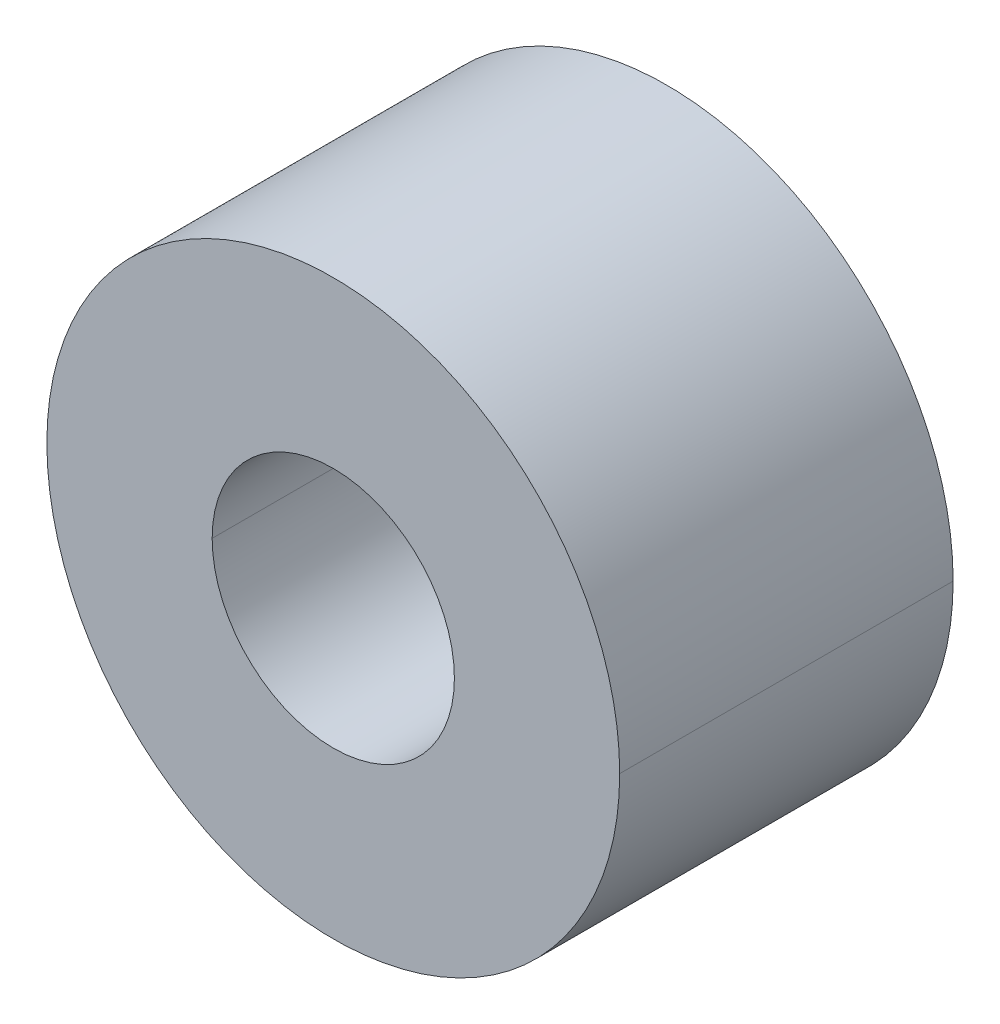
ISO-10303-21;
HEADER;
FILE_DESCRIPTION(('STEP AP214'),'2;1');
FILE_NAME('part.step','',(''),(''),'','','');
FILE_SCHEMA(('AUTOMOTIVE_DESIGN { 1 0 10303 214 1 1 1 1 }'));
ENDSEC;
DATA;
#1=APPLICATION_CONTEXT('core data for automotive mechanical design processes');
#2=APPLICATION_PROTOCOL_DEFINITION('international standard','automotive_design',2000,#1);
#3=PRODUCT_CONTEXT('',#1,'mechanical');
#4=PRODUCT('Part','Part','',(#3));
#5=PRODUCT_RELATED_PRODUCT_CATEGORY('part','',(#4));
#6=PRODUCT_DEFINITION_FORMATION('','',#4);
#7=PRODUCT_DEFINITION_CONTEXT('part definition',#1,'design');
#8=PRODUCT_DEFINITION('design','',#6,#7);
#9=PRODUCT_DEFINITION_SHAPE('','',#8);
#10=(LENGTH_UNIT() NAMED_UNIT(*) SI_UNIT(.MILLI.,.METRE.));
#11=(NAMED_UNIT(*) PLANE_ANGLE_UNIT() SI_UNIT($,.RADIAN.));
#12=(NAMED_UNIT(*) SI_UNIT($,.STERADIAN.) SOLID_ANGLE_UNIT());
#13=UNCERTAINTY_MEASURE_WITH_UNIT(LENGTH_MEASURE(1.E-05),#10,'distance_accuracy_value','');
#14=(GEOMETRIC_REPRESENTATION_CONTEXT(3) GLOBAL_UNCERTAINTY_ASSIGNED_CONTEXT((#13)) GLOBAL_UNIT_ASSIGNED_CONTEXT((#10,
#11,#12)) REPRESENTATION_CONTEXT('',''));
#15=CARTESIAN_POINT('',(0.,0.,0.));
#16=DIRECTION('',(0.,0.,1.));
#17=DIRECTION('',(1.,0.,0.));
#18=AXIS2_PLACEMENT_3D('',#15,#16,#17);
#19=CARTESIAN_POINT('',(0.,0.,0.));
#20=DIRECTION('',(0.,0.,1.));
#21=DIRECTION('',(1.,0.,0.));
#22=AXIS2_PLACEMENT_3D('',#19,#20,#21);
#23=CYLINDRICAL_SURFACE('',#22,20.1);
#24=DIRECTION('',(0.,0.,1.));
#25=VECTOR('',#24,1.);
#26=CARTESIAN_POINT('',(20.1,0.,0.));
#27=LINE('',#26,#25);
#28=CARTESIAN_POINT('',(20.1,0.,0.));
#29=VERTEX_POINT('',#28);
#30=CARTESIAN_POINT('',(20.1,0.,23.4));
#31=VERTEX_POINT('',#30);
#32=EDGE_CURVE('E11',#29,#31,#27,.T.);
#33=ORIENTED_EDGE('',*,*,#32,.T.);
#34=CARTESIAN_POINT('',(0.,0.,23.4));
#35=DIRECTION('',(0.,0.,1.));
#36=DIRECTION('',(-1.,0.,0.));
#37=AXIS2_PLACEMENT_3D('',#34,#35,#36);
#38=CIRCLE('',#37,20.1);
#39=CARTESIAN_POINT('',(-20.1,0.,23.4));
#40=VERTEX_POINT('',#39);
#41=EDGE_CURVE('E70',#40,#31,#38,.T.);
#42=ORIENTED_EDGE('',*,*,#41,.F.);
#43=DIRECTION('',(0.,0.,1.));
#44=VECTOR('',#43,1.);
#45=CARTESIAN_POINT('',(-20.1,0.,0.));
#46=LINE('',#45,#44);
#47=CARTESIAN_POINT('',(-20.1,0.,0.));
#48=VERTEX_POINT('',#47);
#49=EDGE_CURVE('E25',#48,#40,#46,.T.);
#50=ORIENTED_EDGE('',*,*,#49,.F.);
#51=CARTESIAN_POINT('',(0.,0.,0.));
#52=DIRECTION('',(0.,0.,1.));
#53=DIRECTION('',(-1.,0.,0.));
#54=AXIS2_PLACEMENT_3D('',#51,#52,#53);
#55=CIRCLE('',#54,20.1);
#56=EDGE_CURVE('E68',#48,#29,#55,.T.);
#57=ORIENTED_EDGE('',*,*,#56,.T.);
#58=EDGE_LOOP('',(#33,#42,#50,#57));
#59=FACE_BOUND('',#58,.T.);
#60=ADVANCED_FACE('F17',(#59),#23,.T.);
#61=CARTESIAN_POINT('',(0.,0.,0.));
#62=DIRECTION('',(0.,0.,1.));
#63=DIRECTION('',(1.,0.,0.));
#64=AXIS2_PLACEMENT_3D('',#61,#62,#63);
#65=CYLINDRICAL_SURFACE('',#64,20.1);
#66=ORIENTED_EDGE('',*,*,#49,.T.);
#67=CARTESIAN_POINT('',(0.,0.,23.4));
#68=DIRECTION('',(0.,0.,1.));
#69=DIRECTION('',(1.,0.,0.));
#70=AXIS2_PLACEMENT_3D('',#67,#68,#69);
#71=CIRCLE('',#70,20.1);
#72=EDGE_CURVE('E72',#31,#40,#71,.T.);
#73=ORIENTED_EDGE('',*,*,#72,.F.);
#74=ORIENTED_EDGE('',*,*,#32,.F.);
#75=CARTESIAN_POINT('',(0.,0.,0.));
#76=DIRECTION('',(0.,0.,1.));
#77=DIRECTION('',(1.,0.,0.));
#78=AXIS2_PLACEMENT_3D('',#75,#76,#77);
#79=CIRCLE('',#78,20.1);
#80=EDGE_CURVE('E74',#29,#48,#79,.T.);
#81=ORIENTED_EDGE('',*,*,#80,.T.);
#82=EDGE_LOOP('',(#66,#73,#74,#81));
#83=FACE_BOUND('',#82,.T.);
#84=ADVANCED_FACE('F75',(#83),#65,.T.);
#85=CARTESIAN_POINT('',(0.,0.,23.4));
#86=DIRECTION('',(0.,0.,1.));
#87=DIRECTION('',(1.,0.,0.));
#88=AXIS2_PLACEMENT_3D('',#85,#86,#87);
#89=PLANE('',#88);
#90=CARTESIAN_POINT('',(0.,0.,23.4));
#91=DIRECTION('',(0.,0.,-1.));
#92=DIRECTION('',(-1.,0.,0.));
#93=AXIS2_PLACEMENT_3D('',#90,#91,#92);
#94=CIRCLE('',#93,8.5);
#95=CARTESIAN_POINT('',(-8.5,0.,23.4));
#96=VERTEX_POINT('',#95);
#97=CARTESIAN_POINT('',(8.5,0.,23.4));
#98=VERTEX_POINT('',#97);
#99=EDGE_CURVE('E85',#96,#98,#94,.T.);
#100=ORIENTED_EDGE('',*,*,#99,.T.);
#101=CARTESIAN_POINT('',(0.,0.,23.4));
#102=DIRECTION('',(0.,0.,-1.));
#103=DIRECTION('',(1.,0.,0.));
#104=AXIS2_PLACEMENT_3D('',#101,#102,#103);
#105=CIRCLE('',#104,8.5);
#106=EDGE_CURVE('E92',#98,#96,#105,.T.);
#107=ORIENTED_EDGE('',*,*,#106,.T.);
#108=EDGE_LOOP('',(#100,#107));
#109=FACE_BOUND('',#108,.T.);
#110=ORIENTED_EDGE('',*,*,#41,.T.);
#111=ORIENTED_EDGE('',*,*,#72,.T.);
#112=EDGE_LOOP('',(#110,#111));
#113=FACE_BOUND('',#112,.T.);
#114=ADVANCED_FACE('F112',(#109,#113),#89,.T.);
#115=CARTESIAN_POINT('',(0.,0.,0.));
#116=DIRECTION('',(0.,0.,1.));
#117=DIRECTION('',(1.,0.,0.));
#118=AXIS2_PLACEMENT_3D('',#115,#116,#117);
#119=CYLINDRICAL_SURFACE('',#118,8.5);
#120=DIRECTION('',(0.,0.,1.));
#121=VECTOR('',#120,1.);
#122=CARTESIAN_POINT('',(8.5,0.,0.));
#123=LINE('',#122,#121);
#124=CARTESIAN_POINT('',(8.5,0.,0.));
#125=VERTEX_POINT('',#124);
#126=EDGE_CURVE('E88',#125,#98,#123,.T.);
#127=ORIENTED_EDGE('',*,*,#126,.T.);
#128=ORIENTED_EDGE('',*,*,#99,.F.);
#129=DIRECTION('',(0.,0.,1.));
#130=VECTOR('',#129,1.);
#131=CARTESIAN_POINT('',(-8.5,0.,0.));
#132=LINE('',#131,#130);
#133=CARTESIAN_POINT('',(-8.5,0.,0.));
#134=VERTEX_POINT('',#133);
#135=EDGE_CURVE('E100',#134,#96,#132,.T.);
#136=ORIENTED_EDGE('',*,*,#135,.F.);
#137=CARTESIAN_POINT('',(0.,0.,0.));
#138=DIRECTION('',(0.,0.,-1.));
#139=DIRECTION('',(-1.,0.,0.));
#140=AXIS2_PLACEMENT_3D('',#137,#138,#139);
#141=CIRCLE('',#140,8.5);
#142=EDGE_CURVE('E78',#134,#125,#141,.T.);
#143=ORIENTED_EDGE('',*,*,#142,.T.);
#144=EDGE_LOOP('',(#127,#128,#136,#143));
#145=FACE_BOUND('',#144,.T.);
#146=ADVANCED_FACE('F114',(#145),#119,.F.);
#147=CARTESIAN_POINT('',(0.,0.,0.));
#148=DIRECTION('',(0.,0.,1.));
#149=DIRECTION('',(1.,0.,0.));
#150=AXIS2_PLACEMENT_3D('',#147,#148,#149);
#151=CYLINDRICAL_SURFACE('',#150,8.5);
#152=ORIENTED_EDGE('',*,*,#135,.T.);
#153=ORIENTED_EDGE('',*,*,#106,.F.);
#154=ORIENTED_EDGE('',*,*,#126,.F.);
#155=CARTESIAN_POINT('',(0.,0.,0.));
#156=DIRECTION('',(0.,0.,-1.));
#157=DIRECTION('',(1.,0.,0.));
#158=AXIS2_PLACEMENT_3D('',#155,#156,#157);
#159=CIRCLE('',#158,8.5);
#160=EDGE_CURVE('E96',#125,#134,#159,.T.);
#161=ORIENTED_EDGE('',*,*,#160,.T.);
#162=EDGE_LOOP('',(#152,#153,#154,#161));
#163=FACE_BOUND('',#162,.T.);
#164=ADVANCED_FACE('F123',(#163),#151,.F.);
#165=CARTESIAN_POINT('',(0.,0.,0.));
#166=DIRECTION('',(0.,0.,1.));
#167=DIRECTION('',(1.,0.,0.));
#168=AXIS2_PLACEMENT_3D('',#165,#166,#167);
#169=PLANE('',#168);
#170=ORIENTED_EDGE('',*,*,#142,.F.);
#171=ORIENTED_EDGE('',*,*,#160,.F.);
#172=EDGE_LOOP('',(#170,#171));
#173=FACE_BOUND('',#172,.T.);
#174=ORIENTED_EDGE('',*,*,#56,.F.);
#175=ORIENTED_EDGE('',*,*,#80,.F.);
#176=EDGE_LOOP('',(#174,#175));
#177=FACE_BOUND('',#176,.T.);
#178=ADVANCED_FACE('F80',(#173,#177),#169,.F.);
#179=CLOSED_SHELL('',(#60,#84,#114,#146,#164,#178));
#180=MANIFOLD_SOLID_BREP('B1',#179);
#181=ADVANCED_BREP_SHAPE_REPRESENTATION('',(#18,#180),#14);
#182=SHAPE_DEFINITION_REPRESENTATION(#9,#181);
ENDSEC;
END-ISO-10303-21;
